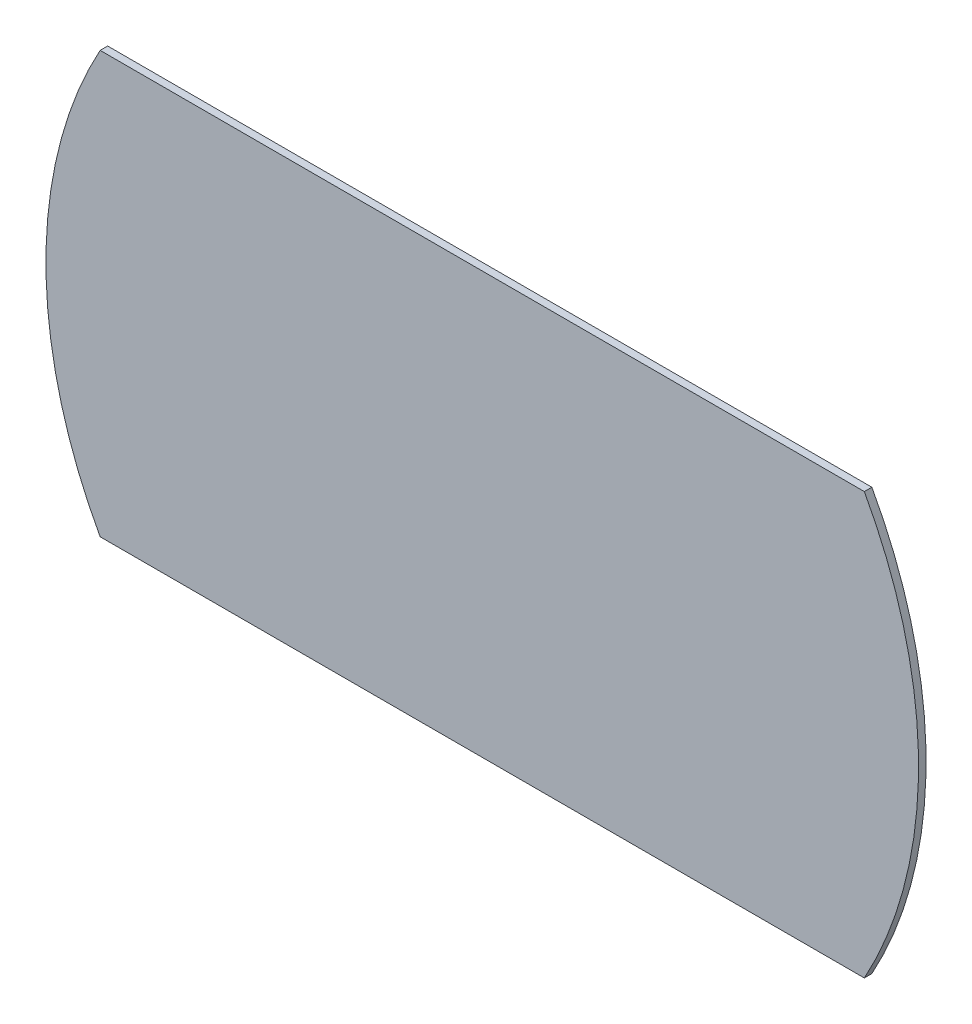
ISO-10303-21;
HEADER;
FILE_DESCRIPTION(('STEP AP214'),'2;1');
FILE_NAME('part.step','',(''),(''),'','','');
FILE_SCHEMA(('AUTOMOTIVE_DESIGN { 1 0 10303 214 1 1 1 1 }'));
ENDSEC;
DATA;
#1=APPLICATION_CONTEXT('core data for automotive mechanical design processes');
#2=APPLICATION_PROTOCOL_DEFINITION('international standard','automotive_design',2000,#1);
#3=PRODUCT_CONTEXT('',#1,'mechanical');
#4=PRODUCT('Part','Part','',(#3));
#5=PRODUCT_RELATED_PRODUCT_CATEGORY('part','',(#4));
#6=PRODUCT_DEFINITION_FORMATION('','',#4);
#7=PRODUCT_DEFINITION_CONTEXT('part definition',#1,'design');
#8=PRODUCT_DEFINITION('design','',#6,#7);
#9=PRODUCT_DEFINITION_SHAPE('','',#8);
#10=(LENGTH_UNIT() NAMED_UNIT(*) SI_UNIT(.MILLI.,.METRE.));
#11=(NAMED_UNIT(*) PLANE_ANGLE_UNIT() SI_UNIT($,.RADIAN.));
#12=(NAMED_UNIT(*) SI_UNIT($,.STERADIAN.) SOLID_ANGLE_UNIT());
#13=UNCERTAINTY_MEASURE_WITH_UNIT(LENGTH_MEASURE(1.E-05),#10,'distance_accuracy_value','');
#14=(GEOMETRIC_REPRESENTATION_CONTEXT(3) GLOBAL_UNCERTAINTY_ASSIGNED_CONTEXT((#13)) GLOBAL_UNIT_ASSIGNED_CONTEXT((#10,
#11,#12)) REPRESENTATION_CONTEXT('',''));
#15=CARTESIAN_POINT('',(0.,0.,0.));
#16=DIRECTION('',(0.,0.,1.));
#17=DIRECTION('',(1.,0.,0.));
#18=AXIS2_PLACEMENT_3D('',#15,#16,#17);
#19=CARTESIAN_POINT('',(0.,0.,0.));
#20=DIRECTION('',(0.,0.,1.));
#21=DIRECTION('',(1.,0.,0.));
#22=AXIS2_PLACEMENT_3D('',#19,#20,#21);
#23=PLANE('',#22);
#24=CARTESIAN_POINT('',(0.,0.,0.));
#25=DIRECTION('',(0.,0.,1.));
#26=DIRECTION('',(1.,0.,0.));
#27=AXIS2_PLACEMENT_3D('',#24,#25,#26);
#28=CIRCLE('',#27,29.);
#29=CARTESIAN_POINT('',(25.3968501984006,-14.,0.));
#30=VERTEX_POINT('',#29);
#31=CARTESIAN_POINT('',(25.3968501984006,14.,0.));
#32=VERTEX_POINT('',#31);
#33=EDGE_CURVE('E121',#30,#32,#28,.T.);
#34=ORIENTED_EDGE('',*,*,#33,.F.);
#35=DIRECTION('',(1.,0.,0.));
#36=VECTOR('',#35,1.);
#37=CARTESIAN_POINT('',(25.3968501984006,-14.,0.));
#38=LINE('',#37,#36);
#39=CARTESIAN_POINT('',(-25.3968501984006,-14.,0.));
#40=VERTEX_POINT('',#39);
#41=EDGE_CURVE('E134',#40,#30,#38,.T.);
#42=ORIENTED_EDGE('',*,*,#41,.F.);
#43=CARTESIAN_POINT('',(0.,0.,0.));
#44=DIRECTION('',(0.,0.,1.));
#45=DIRECTION('',(1.,0.,0.));
#46=AXIS2_PLACEMENT_3D('',#43,#44,#45);
#47=CIRCLE('',#46,29.);
#48=CARTESIAN_POINT('',(-25.3968501984006,14.,0.));
#49=VERTEX_POINT('',#48);
#50=EDGE_CURVE('E142',#49,#40,#47,.T.);
#51=ORIENTED_EDGE('',*,*,#50,.F.);
#52=DIRECTION('',(-1.,0.,0.));
#53=VECTOR('',#52,1.);
#54=CARTESIAN_POINT('',(25.3968501984006,14.,0.));
#55=LINE('',#54,#53);
#56=EDGE_CURVE('E124',#32,#49,#55,.T.);
#57=ORIENTED_EDGE('',*,*,#56,.F.);
#58=EDGE_LOOP('',(#34,#42,#51,#57));
#59=FACE_BOUND('',#58,.T.);
#60=CARTESIAN_POINT('',(0.,0.,0.));
#61=DIRECTION('',(0.,0.,-1.));
#62=DIRECTION('',(-1.,0.,0.));
#63=AXIS2_PLACEMENT_3D('',#60,#61,#62);
#64=CIRCLE('',#63,27.5);
#65=CARTESIAN_POINT('',(24.4948974278318,12.5,0.));
#66=VERTEX_POINT('',#65);
#67=CARTESIAN_POINT('',(24.4948974278318,-12.5,0.));
#68=VERTEX_POINT('',#67);
#69=EDGE_CURVE('E51',#66,#68,#64,.T.);
#70=ORIENTED_EDGE('',*,*,#69,.F.);
#71=DIRECTION('',(1.,0.,0.));
#72=VECTOR('',#71,1.);
#73=CARTESIAN_POINT('',(-24.4948974278318,12.5,0.));
#74=LINE('',#73,#72);
#75=CARTESIAN_POINT('',(-24.4948974278318,12.5,0.));
#76=VERTEX_POINT('',#75);
#77=EDGE_CURVE('E55',#76,#66,#74,.T.);
#78=ORIENTED_EDGE('',*,*,#77,.F.);
#79=CARTESIAN_POINT('',(0.,0.,0.));
#80=DIRECTION('',(0.,0.,-1.));
#81=DIRECTION('',(-1.,0.,0.));
#82=AXIS2_PLACEMENT_3D('',#79,#80,#81);
#83=CIRCLE('',#82,27.5);
#84=CARTESIAN_POINT('',(-24.4948974278318,-12.5,0.));
#85=VERTEX_POINT('',#84);
#86=EDGE_CURVE('E267',#85,#76,#83,.T.);
#87=ORIENTED_EDGE('',*,*,#86,.F.);
#88=DIRECTION('',(-1.,0.,0.));
#89=VECTOR('',#88,1.);
#90=CARTESIAN_POINT('',(24.4948974278318,-12.5,0.));
#91=LINE('',#90,#89);
#92=EDGE_CURVE('E273',#68,#85,#91,.T.);
#93=ORIENTED_EDGE('',*,*,#92,.F.);
#94=EDGE_LOOP('',(#70,#78,#87,#93));
#95=FACE_BOUND('',#94,.T.);
#96=ADVANCED_FACE('F36',(#59,#95),#23,.F.);
#97=CARTESIAN_POINT('',(0.,0.,0.5));
#98=DIRECTION('',(0.,0.,-1.));
#99=DIRECTION('',(-1.,0.,0.));
#100=AXIS2_PLACEMENT_3D('',#97,#98,#99);
#101=CYLINDRICAL_SURFACE('',#100,29.);
#102=ORIENTED_EDGE('',*,*,#33,.T.);
#103=DIRECTION('',(0.,0.,-1.));
#104=VECTOR('',#103,1.);
#105=CARTESIAN_POINT('',(25.3968501984006,14.,0.5));
#106=LINE('',#105,#104);
#107=CARTESIAN_POINT('',(25.3968501984006,14.,0.5));
#108=VERTEX_POINT('',#107);
#109=EDGE_CURVE('E11',#108,#32,#106,.T.);
#110=ORIENTED_EDGE('',*,*,#109,.F.);
#111=CARTESIAN_POINT('',(0.,0.,0.5));
#112=DIRECTION('',(0.,0.,1.));
#113=DIRECTION('',(1.,0.,0.));
#114=AXIS2_PLACEMENT_3D('',#111,#112,#113);
#115=CIRCLE('',#114,29.);
#116=CARTESIAN_POINT('',(25.3968501984006,-14.,0.5));
#117=VERTEX_POINT('',#116);
#118=EDGE_CURVE('E130',#117,#108,#115,.T.);
#119=ORIENTED_EDGE('',*,*,#118,.F.);
#120=DIRECTION('',(0.,0.,-1.));
#121=VECTOR('',#120,1.);
#122=CARTESIAN_POINT('',(25.3968501984006,-14.,0.5));
#123=LINE('',#122,#121);
#124=EDGE_CURVE('E139',#117,#30,#123,.T.);
#125=ORIENTED_EDGE('',*,*,#124,.T.);
#126=EDGE_LOOP('',(#102,#110,#119,#125));
#127=FACE_BOUND('',#126,.T.);
#128=ADVANCED_FACE('F38',(#127),#101,.T.);
#129=CARTESIAN_POINT('',(25.3968501984006,14.,0.5));
#130=DIRECTION('',(0.,-1.,0.));
#131=DIRECTION('',(0.,0.,-1.));
#132=AXIS2_PLACEMENT_3D('',#129,#130,#131);
#133=PLANE('',#132);
#134=ORIENTED_EDGE('',*,*,#56,.T.);
#135=DIRECTION('',(0.,0.,-1.));
#136=VECTOR('',#135,1.);
#137=CARTESIAN_POINT('',(-25.3968501984006,14.,0.5));
#138=LINE('',#137,#136);
#139=CARTESIAN_POINT('',(-25.3968501984006,14.,0.5));
#140=VERTEX_POINT('',#139);
#141=EDGE_CURVE('E44',#140,#49,#138,.T.);
#142=ORIENTED_EDGE('',*,*,#141,.F.);
#143=DIRECTION('',(-1.,0.,0.));
#144=VECTOR('',#143,1.);
#145=CARTESIAN_POINT('',(25.3968501984006,14.,0.5));
#146=LINE('',#145,#144);
#147=EDGE_CURVE('E133',#108,#140,#146,.T.);
#148=ORIENTED_EDGE('',*,*,#147,.F.);
#149=ORIENTED_EDGE('',*,*,#109,.T.);
#150=EDGE_LOOP('',(#134,#142,#148,#149));
#151=FACE_BOUND('',#150,.T.);
#152=ADVANCED_FACE('F169',(#151),#133,.F.);
#153=CARTESIAN_POINT('',(0.,0.,0.5));
#154=DIRECTION('',(0.,0.,-1.));
#155=DIRECTION('',(-1.,0.,0.));
#156=AXIS2_PLACEMENT_3D('',#153,#154,#155);
#157=CYLINDRICAL_SURFACE('',#156,29.);
#158=ORIENTED_EDGE('',*,*,#50,.T.);
#159=DIRECTION('',(0.,0.,-1.));
#160=VECTOR('',#159,1.);
#161=CARTESIAN_POINT('',(-25.3968501984006,-14.,0.5));
#162=LINE('',#161,#160);
#163=CARTESIAN_POINT('',(-25.3968501984006,-14.,0.5));
#164=VERTEX_POINT('',#163);
#165=EDGE_CURVE('E147',#164,#40,#162,.T.);
#166=ORIENTED_EDGE('',*,*,#165,.F.);
#167=CARTESIAN_POINT('',(0.,0.,0.5));
#168=DIRECTION('',(0.,0.,1.));
#169=DIRECTION('',(1.,0.,0.));
#170=AXIS2_PLACEMENT_3D('',#167,#168,#169);
#171=CIRCLE('',#170,29.);
#172=EDGE_CURVE('E136',#140,#164,#171,.T.);
#173=ORIENTED_EDGE('',*,*,#172,.F.);
#174=ORIENTED_EDGE('',*,*,#141,.T.);
#175=EDGE_LOOP('',(#158,#166,#173,#174));
#176=FACE_BOUND('',#175,.T.);
#177=ADVANCED_FACE('F154',(#176),#157,.T.);
#178=CARTESIAN_POINT('',(25.3968501984006,-14.,0.5));
#179=DIRECTION('',(0.,1.,0.));
#180=DIRECTION('',(0.,0.,1.));
#181=AXIS2_PLACEMENT_3D('',#178,#179,#180);
#182=PLANE('',#181);
#183=ORIENTED_EDGE('',*,*,#41,.T.);
#184=ORIENTED_EDGE('',*,*,#124,.F.);
#185=DIRECTION('',(1.,0.,0.));
#186=VECTOR('',#185,1.);
#187=CARTESIAN_POINT('',(25.3968501984006,-14.,0.5));
#188=LINE('',#187,#186);
#189=EDGE_CURVE('E138',#164,#117,#188,.T.);
#190=ORIENTED_EDGE('',*,*,#189,.F.);
#191=ORIENTED_EDGE('',*,*,#165,.T.);
#192=EDGE_LOOP('',(#183,#184,#190,#191));
#193=FACE_BOUND('',#192,.T.);
#194=ADVANCED_FACE('F162',(#193),#182,.F.);
#195=CARTESIAN_POINT('',(0.,0.,0.5));
#196=DIRECTION('',(0.,0.,1.));
#197=DIRECTION('',(1.,0.,0.));
#198=AXIS2_PLACEMENT_3D('',#195,#196,#197);
#199=PLANE('',#198);
#200=ORIENTED_EDGE('',*,*,#118,.T.);
#201=ORIENTED_EDGE('',*,*,#147,.T.);
#202=ORIENTED_EDGE('',*,*,#172,.T.);
#203=ORIENTED_EDGE('',*,*,#189,.T.);
#204=EDGE_LOOP('',(#200,#201,#202,#203));
#205=FACE_BOUND('',#204,.T.);
#206=ADVANCED_FACE('F168',(#205),#199,.T.);
#207=CARTESIAN_POINT('',(0.,0.,-0.2));
#208=DIRECTION('',(0.,0.,1.));
#209=DIRECTION('',(1.,0.,0.));
#210=AXIS2_PLACEMENT_3D('',#207,#208,#209);
#211=CYLINDRICAL_SURFACE('',#210,27.5);
#212=ORIENTED_EDGE('',*,*,#69,.T.);
#213=DIRECTION('',(0.,0.,1.));
#214=VECTOR('',#213,1.);
#215=CARTESIAN_POINT('',(24.4948974278318,-12.5,-0.2));
#216=LINE('',#215,#214);
#217=CARTESIAN_POINT('',(24.4948974278318,-12.5,-0.2));
#218=VERTEX_POINT('',#217);
#219=EDGE_CURVE('E104',#218,#68,#216,.T.);
#220=ORIENTED_EDGE('',*,*,#219,.F.);
#221=CARTESIAN_POINT('',(0.,0.,-0.2));
#222=DIRECTION('',(0.,0.,-1.));
#223=DIRECTION('',(-1.,0.,0.));
#224=AXIS2_PLACEMENT_3D('',#221,#222,#223);
#225=CIRCLE('',#224,27.5);
#226=CARTESIAN_POINT('',(24.4948974278318,12.5,-0.2));
#227=VERTEX_POINT('',#226);
#228=EDGE_CURVE('E110',#227,#218,#225,.T.);
#229=ORIENTED_EDGE('',*,*,#228,.F.);
#230=DIRECTION('',(0.,0.,1.));
#231=VECTOR('',#230,1.);
#232=CARTESIAN_POINT('',(24.4948974278318,12.5,-0.2));
#233=LINE('',#232,#231);
#234=EDGE_CURVE('E265',#227,#66,#233,.T.);
#235=ORIENTED_EDGE('',*,*,#234,.T.);
#236=EDGE_LOOP('',(#212,#220,#229,#235));
#237=FACE_BOUND('',#236,.T.);
#238=ADVANCED_FACE('F120',(#237),#211,.T.);
#239=CARTESIAN_POINT('',(24.4948974278318,-12.5,-0.2));
#240=DIRECTION('',(0.,1.,0.));
#241=DIRECTION('',(0.,0.,1.));
#242=AXIS2_PLACEMENT_3D('',#239,#240,#241);
#243=PLANE('',#242);
#244=ORIENTED_EDGE('',*,*,#92,.T.);
#245=DIRECTION('',(0.,0.,1.));
#246=VECTOR('',#245,1.);
#247=CARTESIAN_POINT('',(-24.4948974278318,-12.5,-0.2));
#248=LINE('',#247,#246);
#249=CARTESIAN_POINT('',(-24.4948974278318,-12.5,-0.2));
#250=VERTEX_POINT('',#249);
#251=EDGE_CURVE('E106',#250,#85,#248,.T.);
#252=ORIENTED_EDGE('',*,*,#251,.F.);
#253=DIRECTION('',(-1.,0.,0.));
#254=VECTOR('',#253,1.);
#255=CARTESIAN_POINT('',(24.4948974278318,-12.5,-0.2));
#256=LINE('',#255,#254);
#257=EDGE_CURVE('E99',#218,#250,#256,.T.);
#258=ORIENTED_EDGE('',*,*,#257,.F.);
#259=ORIENTED_EDGE('',*,*,#219,.T.);
#260=EDGE_LOOP('',(#244,#252,#258,#259));
#261=FACE_BOUND('',#260,.T.);
#262=ADVANCED_FACE('F102',(#261),#243,.F.);
#263=CARTESIAN_POINT('',(0.,0.,-0.2));
#264=DIRECTION('',(0.,0.,1.));
#265=DIRECTION('',(1.,0.,0.));
#266=AXIS2_PLACEMENT_3D('',#263,#264,#265);
#267=CYLINDRICAL_SURFACE('',#266,27.5);
#268=ORIENTED_EDGE('',*,*,#86,.T.);
#269=DIRECTION('',(0.,0.,1.));
#270=VECTOR('',#269,1.);
#271=CARTESIAN_POINT('',(-24.4948974278318,12.5,-0.2));
#272=LINE('',#271,#270);
#273=CARTESIAN_POINT('',(-24.4948974278318,12.5,-0.2));
#274=VERTEX_POINT('',#273);
#275=EDGE_CURVE('E126',#274,#76,#272,.T.);
#276=ORIENTED_EDGE('',*,*,#275,.F.);
#277=CARTESIAN_POINT('',(0.,0.,-0.2));
#278=DIRECTION('',(0.,0.,-1.));
#279=DIRECTION('',(-1.,0.,0.));
#280=AXIS2_PLACEMENT_3D('',#277,#278,#279);
#281=CIRCLE('',#280,27.5);
#282=EDGE_CURVE('E109',#250,#274,#281,.T.);
#283=ORIENTED_EDGE('',*,*,#282,.F.);
#284=ORIENTED_EDGE('',*,*,#251,.T.);
#285=EDGE_LOOP('',(#268,#276,#283,#284));
#286=FACE_BOUND('',#285,.T.);
#287=ADVANCED_FACE('F193',(#286),#267,.T.);
#288=CARTESIAN_POINT('',(-24.4948974278318,12.5,-0.2));
#289=DIRECTION('',(0.,-1.,0.));
#290=DIRECTION('',(0.,0.,-1.));
#291=AXIS2_PLACEMENT_3D('',#288,#289,#290);
#292=PLANE('',#291);
#293=ORIENTED_EDGE('',*,*,#77,.T.);
#294=ORIENTED_EDGE('',*,*,#234,.F.);
#295=DIRECTION('',(1.,0.,0.));
#296=VECTOR('',#295,1.);
#297=CARTESIAN_POINT('',(-24.4948974278318,12.5,-0.2));
#298=LINE('',#297,#296);
#299=EDGE_CURVE('E115',#274,#227,#298,.T.);
#300=ORIENTED_EDGE('',*,*,#299,.F.);
#301=ORIENTED_EDGE('',*,*,#275,.T.);
#302=EDGE_LOOP('',(#293,#294,#300,#301));
#303=FACE_BOUND('',#302,.T.);
#304=ADVANCED_FACE('F198',(#303),#292,.F.);
#305=CARTESIAN_POINT('',(0.,0.,-0.2));
#306=DIRECTION('',(0.,0.,-1.));
#307=DIRECTION('',(-1.,0.,0.));
#308=AXIS2_PLACEMENT_3D('',#305,#306,#307);
#309=PLANE('',#308);
#310=ORIENTED_EDGE('',*,*,#228,.T.);
#311=ORIENTED_EDGE('',*,*,#257,.T.);
#312=ORIENTED_EDGE('',*,*,#282,.T.);
#313=ORIENTED_EDGE('',*,*,#299,.T.);
#314=EDGE_LOOP('',(#310,#311,#312,#313));
#315=FACE_BOUND('',#314,.T.);
#316=ADVANCED_FACE('F113',(#315),#309,.T.);
#317=CLOSED_SHELL('',(#96,#128,#152,#177,#194,#206,#238,#262,#287,#304,#316));
#318=MANIFOLD_SOLID_BREP('B2',#317);
#319=ADVANCED_BREP_SHAPE_REPRESENTATION('',(#18,#318),#14);
#320=SHAPE_DEFINITION_REPRESENTATION(#9,#319);
ENDSEC;
END-ISO-10303-21;
